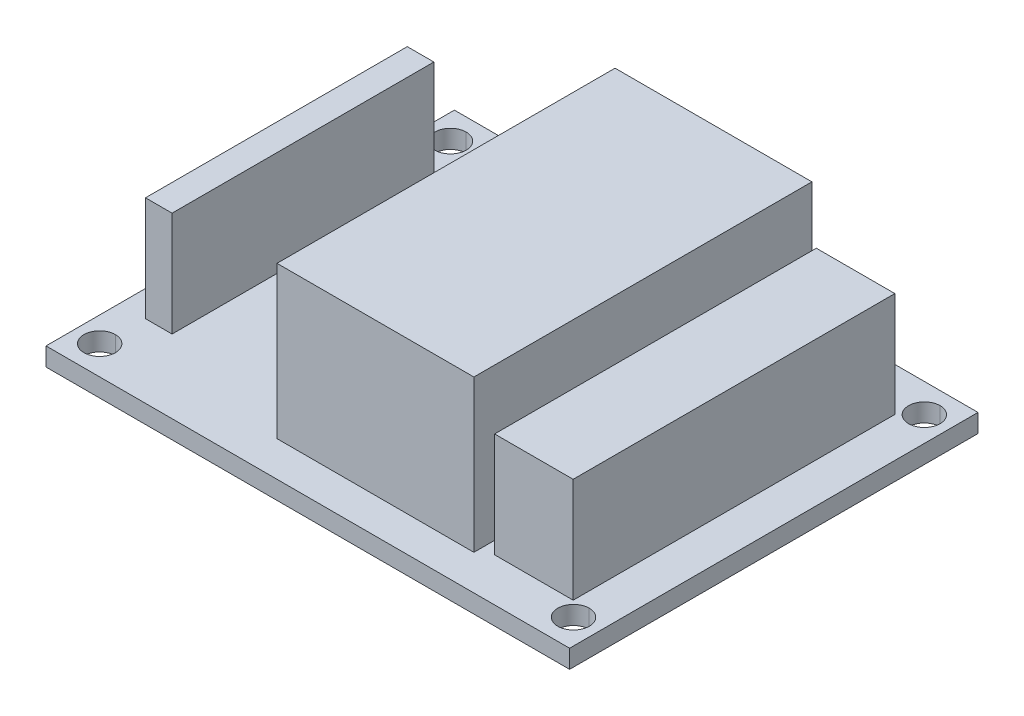
ISO-10303-21;
HEADER;
FILE_DESCRIPTION(('STEP AP214'),'2;1');
FILE_NAME('part.step','',(''),(''),'','','');
FILE_SCHEMA(('AUTOMOTIVE_DESIGN { 1 0 10303 214 1 1 1 1 }'));
ENDSEC;
DATA;
#1=APPLICATION_CONTEXT('core data for automotive mechanical design processes');
#2=APPLICATION_PROTOCOL_DEFINITION('international standard','automotive_design',2000,#1);
#3=PRODUCT_CONTEXT('',#1,'mechanical');
#4=PRODUCT('Part','Part','',(#3));
#5=PRODUCT_RELATED_PRODUCT_CATEGORY('part','',(#4));
#6=PRODUCT_DEFINITION_FORMATION('','',#4);
#7=PRODUCT_DEFINITION_CONTEXT('part definition',#1,'design');
#8=PRODUCT_DEFINITION('design','',#6,#7);
#9=PRODUCT_DEFINITION_SHAPE('','',#8);
#10=(LENGTH_UNIT() NAMED_UNIT(*) SI_UNIT(.MILLI.,.METRE.));
#11=(NAMED_UNIT(*) PLANE_ANGLE_UNIT() SI_UNIT($,.RADIAN.));
#12=(NAMED_UNIT(*) SI_UNIT($,.STERADIAN.) SOLID_ANGLE_UNIT());
#13=UNCERTAINTY_MEASURE_WITH_UNIT(LENGTH_MEASURE(1.E-05),#10,'distance_accuracy_value','');
#14=(GEOMETRIC_REPRESENTATION_CONTEXT(3) GLOBAL_UNCERTAINTY_ASSIGNED_CONTEXT((#13)) GLOBAL_UNIT_ASSIGNED_CONTEXT((#10,
#11,#12)) REPRESENTATION_CONTEXT('',''));
#15=CARTESIAN_POINT('',(0.,0.,0.));
#16=DIRECTION('',(0.,0.,1.));
#17=DIRECTION('',(1.,0.,0.));
#18=AXIS2_PLACEMENT_3D('',#15,#16,#17);
#19=CARTESIAN_POINT('',(0.,11.75,0.));
#20=DIRECTION('',(0.,1.,0.));
#21=DIRECTION('',(1.,0.,0.));
#22=AXIS2_PLACEMENT_3D('',#19,#20,#21);
#23=PLANE('',#22);
#24=DIRECTION('',(0.,0.,-1.));
#25=VECTOR('',#24,1.);
#26=CARTESIAN_POINT('',(-19.96,11.75,-12.5));
#27=LINE('',#26,#25);
#28=CARTESIAN_POINT('',(-19.96,11.75,12.5));
#29=VERTEX_POINT('',#28);
#30=CARTESIAN_POINT('',(-19.96,11.75,-12.5));
#31=VERTEX_POINT('',#30);
#32=EDGE_CURVE('E324',#29,#31,#27,.T.);
#33=ORIENTED_EDGE('',*,*,#32,.T.);
#34=DIRECTION('',(-1.,0.,0.));
#35=VECTOR('',#34,1.);
#36=CARTESIAN_POINT('',(-22.5,11.75,-12.5));
#37=LINE('',#36,#35);
#38=CARTESIAN_POINT('',(-22.5,11.75,-12.5));
#39=VERTEX_POINT('',#38);
#40=EDGE_CURVE('E403',#31,#39,#37,.T.);
#41=ORIENTED_EDGE('',*,*,#40,.T.);
#42=DIRECTION('',(0.,0.,1.));
#43=VECTOR('',#42,1.);
#44=CARTESIAN_POINT('',(-22.5,11.75,-12.5));
#45=LINE('',#44,#43);
#46=CARTESIAN_POINT('',(-22.5,11.75,12.5));
#47=VERTEX_POINT('',#46);
#48=EDGE_CURVE('E25',#39,#47,#45,.T.);
#49=ORIENTED_EDGE('',*,*,#48,.T.);
#50=DIRECTION('',(1.,0.,0.));
#51=VECTOR('',#50,1.);
#52=CARTESIAN_POINT('',(-22.5,11.75,12.5));
#53=LINE('',#52,#51);
#54=EDGE_CURVE('E10',#47,#29,#53,.T.);
#55=ORIENTED_EDGE('',*,*,#54,.T.);
#56=EDGE_LOOP('',(#33,#41,#49,#55));
#57=FACE_BOUND('',#56,.T.);
#58=ADVANCED_FACE('F15',(#57),#23,.T.);
#59=CARTESIAN_POINT('',(-22.5,11.75,12.5));
#60=DIRECTION('',(0.,0.,-1.));
#61=DIRECTION('',(0.,-1.,0.));
#62=AXIS2_PLACEMENT_3D('',#59,#60,#61);
#63=PLANE('',#62);
#64=DIRECTION('',(1.,0.,0.));
#65=VECTOR('',#64,1.);
#66=CARTESIAN_POINT('',(-22.5,1.75,12.5));
#67=LINE('',#66,#65);
#68=CARTESIAN_POINT('',(-22.5,1.75,12.5));
#69=VERTEX_POINT('',#68);
#70=CARTESIAN_POINT('',(-19.96,1.75,12.5));
#71=VERTEX_POINT('',#70);
#72=EDGE_CURVE('E428',#69,#71,#67,.T.);
#73=ORIENTED_EDGE('',*,*,#72,.T.);
#74=DIRECTION('',(0.,-1.,0.));
#75=VECTOR('',#74,1.);
#76=CARTESIAN_POINT('',(-19.96,11.75,12.5));
#77=LINE('',#76,#75);
#78=EDGE_CURVE('E395',#29,#71,#77,.T.);
#79=ORIENTED_EDGE('',*,*,#78,.F.);
#80=ORIENTED_EDGE('',*,*,#54,.F.);
#81=DIRECTION('',(0.,-1.,0.));
#82=VECTOR('',#81,1.);
#83=CARTESIAN_POINT('',(-22.5,11.75,12.5));
#84=LINE('',#83,#82);
#85=EDGE_CURVE('E439',#47,#69,#84,.T.);
#86=ORIENTED_EDGE('',*,*,#85,.T.);
#87=EDGE_LOOP('',(#73,#79,#80,#86));
#88=FACE_BOUND('',#87,.T.);
#89=ADVANCED_FACE('F722',(#88),#63,.F.);
#90=CARTESIAN_POINT('',(-22.5,11.75,-12.5));
#91=DIRECTION('',(1.,0.,0.));
#92=DIRECTION('',(0.,0.,-1.));
#93=AXIS2_PLACEMENT_3D('',#90,#91,#92);
#94=PLANE('',#93);
#95=DIRECTION('',(0.,0.,1.));
#96=VECTOR('',#95,1.);
#97=CARTESIAN_POINT('',(-22.5,1.75,-12.5));
#98=LINE('',#97,#96);
#99=CARTESIAN_POINT('',(-22.5,1.75,-12.5));
#100=VERTEX_POINT('',#99);
#101=EDGE_CURVE('E419',#100,#69,#98,.T.);
#102=ORIENTED_EDGE('',*,*,#101,.T.);
#103=ORIENTED_EDGE('',*,*,#85,.F.);
#104=ORIENTED_EDGE('',*,*,#48,.F.);
#105=DIRECTION('',(0.,-1.,0.));
#106=VECTOR('',#105,1.);
#107=CARTESIAN_POINT('',(-22.5,11.75,-12.5));
#108=LINE('',#107,#106);
#109=EDGE_CURVE('E400',#39,#100,#108,.T.);
#110=ORIENTED_EDGE('',*,*,#109,.T.);
#111=EDGE_LOOP('',(#102,#103,#104,#110));
#112=FACE_BOUND('',#111,.T.);
#113=ADVANCED_FACE('F718',(#112),#94,.F.);
#114=CARTESIAN_POINT('',(-22.5,11.75,-12.5));
#115=DIRECTION('',(0.,0.,1.));
#116=DIRECTION('',(1.,0.,0.));
#117=AXIS2_PLACEMENT_3D('',#114,#115,#116);
#118=PLANE('',#117);
#119=DIRECTION('',(-1.,0.,0.));
#120=VECTOR('',#119,1.);
#121=CARTESIAN_POINT('',(-22.5,1.75,-12.5));
#122=LINE('',#121,#120);
#123=CARTESIAN_POINT('',(-19.96,1.75,-12.5));
#124=VERTEX_POINT('',#123);
#125=EDGE_CURVE('E452',#124,#100,#122,.T.);
#126=ORIENTED_EDGE('',*,*,#125,.T.);
#127=ORIENTED_EDGE('',*,*,#109,.F.);
#128=ORIENTED_EDGE('',*,*,#40,.F.);
#129=DIRECTION('',(0.,-1.,0.));
#130=VECTOR('',#129,1.);
#131=CARTESIAN_POINT('',(-19.96,11.75,-12.5));
#132=LINE('',#131,#130);
#133=EDGE_CURVE('E321',#31,#124,#132,.T.);
#134=ORIENTED_EDGE('',*,*,#133,.T.);
#135=EDGE_LOOP('',(#126,#127,#128,#134));
#136=FACE_BOUND('',#135,.T.);
#137=ADVANCED_FACE('F527',(#136),#118,.F.);
#138=CARTESIAN_POINT('',(-19.96,11.75,-12.5));
#139=DIRECTION('',(-1.,0.,0.));
#140=DIRECTION('',(0.,0.,1.));
#141=AXIS2_PLACEMENT_3D('',#138,#139,#140);
#142=PLANE('',#141);
#143=DIRECTION('',(0.,0.,-1.));
#144=VECTOR('',#143,1.);
#145=CARTESIAN_POINT('',(-19.96,1.75,-12.5));
#146=LINE('',#145,#144);
#147=EDGE_CURVE('E364',#71,#124,#146,.T.);
#148=ORIENTED_EDGE('',*,*,#147,.T.);
#149=ORIENTED_EDGE('',*,*,#133,.F.);
#150=ORIENTED_EDGE('',*,*,#32,.F.);
#151=ORIENTED_EDGE('',*,*,#78,.T.);
#152=EDGE_LOOP('',(#148,#149,#150,#151));
#153=FACE_BOUND('',#152,.T.);
#154=ADVANCED_FACE('F517',(#153),#142,.F.);
#155=CARTESIAN_POINT('',(0.,11.75,0.));
#156=DIRECTION('',(0.,1.,0.));
#157=DIRECTION('',(1.,0.,0.));
#158=AXIS2_PLACEMENT_3D('',#155,#156,#157);
#159=PLANE('',#158);
#160=DIRECTION('',(0.,0.,-1.));
#161=VECTOR('',#160,1.);
#162=CARTESIAN_POINT('',(21.2,11.75,-15.36));
#163=LINE('',#162,#161);
#164=CARTESIAN_POINT('',(21.2,11.75,15.36));
#165=VERTEX_POINT('',#164);
#166=CARTESIAN_POINT('',(21.2,11.75,-15.36));
#167=VERTEX_POINT('',#166);
#168=EDGE_CURVE('E348',#165,#167,#163,.T.);
#169=ORIENTED_EDGE('',*,*,#168,.T.);
#170=DIRECTION('',(-1.,0.,0.));
#171=VECTOR('',#170,1.);
#172=CARTESIAN_POINT('',(13.7,11.75,-15.36));
#173=LINE('',#172,#171);
#174=CARTESIAN_POINT('',(13.7,11.75,-15.36));
#175=VERTEX_POINT('',#174);
#176=EDGE_CURVE('E311',#167,#175,#173,.T.);
#177=ORIENTED_EDGE('',*,*,#176,.T.);
#178=DIRECTION('',(0.,0.,1.));
#179=VECTOR('',#178,1.);
#180=CARTESIAN_POINT('',(13.7,11.75,-15.36));
#181=LINE('',#180,#179);
#182=CARTESIAN_POINT('',(13.7,11.75,15.36));
#183=VERTEX_POINT('',#182);
#184=EDGE_CURVE('E356',#175,#183,#181,.T.);
#185=ORIENTED_EDGE('',*,*,#184,.T.);
#186=DIRECTION('',(1.,0.,0.));
#187=VECTOR('',#186,1.);
#188=CARTESIAN_POINT('',(13.7,11.75,15.36));
#189=LINE('',#188,#187);
#190=EDGE_CURVE('E325',#183,#165,#189,.T.);
#191=ORIENTED_EDGE('',*,*,#190,.T.);
#192=EDGE_LOOP('',(#169,#177,#185,#191));
#193=FACE_BOUND('',#192,.T.);
#194=ADVANCED_FACE('F695',(#193),#159,.T.);
#195=CARTESIAN_POINT('',(13.7,11.75,15.36));
#196=DIRECTION('',(0.,0.,-1.));
#197=DIRECTION('',(0.,-1.,0.));
#198=AXIS2_PLACEMENT_3D('',#195,#196,#197);
#199=PLANE('',#198);
#200=DIRECTION('',(1.,0.,0.));
#201=VECTOR('',#200,1.);
#202=CARTESIAN_POINT('',(13.7,1.75,15.36));
#203=LINE('',#202,#201);
#204=CARTESIAN_POINT('',(13.7,1.75,15.36));
#205=VERTEX_POINT('',#204);
#206=CARTESIAN_POINT('',(21.2,1.75,15.36));
#207=VERTEX_POINT('',#206);
#208=EDGE_CURVE('E279',#205,#207,#203,.T.);
#209=ORIENTED_EDGE('',*,*,#208,.T.);
#210=DIRECTION('',(0.,-1.,0.));
#211=VECTOR('',#210,1.);
#212=CARTESIAN_POINT('',(21.2,11.75,15.36));
#213=LINE('',#212,#211);
#214=EDGE_CURVE('E352',#165,#207,#213,.T.);
#215=ORIENTED_EDGE('',*,*,#214,.F.);
#216=ORIENTED_EDGE('',*,*,#190,.F.);
#217=DIRECTION('',(0.,-1.,0.));
#218=VECTOR('',#217,1.);
#219=CARTESIAN_POINT('',(13.7,11.75,15.36));
#220=LINE('',#219,#218);
#221=EDGE_CURVE('E315',#183,#205,#220,.T.);
#222=ORIENTED_EDGE('',*,*,#221,.T.);
#223=EDGE_LOOP('',(#209,#215,#216,#222));
#224=FACE_BOUND('',#223,.T.);
#225=ADVANCED_FACE('F691',(#224),#199,.F.);
#226=CARTESIAN_POINT('',(13.7,11.75,-15.36));
#227=DIRECTION('',(1.,0.,0.));
#228=DIRECTION('',(0.,0.,-1.));
#229=AXIS2_PLACEMENT_3D('',#226,#227,#228);
#230=PLANE('',#229);
#231=DIRECTION('',(0.,0.,1.));
#232=VECTOR('',#231,1.);
#233=CARTESIAN_POINT('',(13.7,1.75,-15.36));
#234=LINE('',#233,#232);
#235=CARTESIAN_POINT('',(13.7,1.75,-15.36));
#236=VERTEX_POINT('',#235);
#237=EDGE_CURVE('E478',#236,#205,#234,.T.);
#238=ORIENTED_EDGE('',*,*,#237,.T.);
#239=ORIENTED_EDGE('',*,*,#221,.F.);
#240=ORIENTED_EDGE('',*,*,#184,.F.);
#241=DIRECTION('',(0.,-1.,0.));
#242=VECTOR('',#241,1.);
#243=CARTESIAN_POINT('',(13.7,11.75,-15.36));
#244=LINE('',#243,#242);
#245=EDGE_CURVE('E316',#175,#236,#244,.T.);
#246=ORIENTED_EDGE('',*,*,#245,.T.);
#247=EDGE_LOOP('',(#238,#239,#240,#246));
#248=FACE_BOUND('',#247,.T.);
#249=ADVANCED_FACE('F624',(#248),#230,.F.);
#250=CARTESIAN_POINT('',(13.7,11.75,-15.36));
#251=DIRECTION('',(0.,0.,1.));
#252=DIRECTION('',(1.,0.,0.));
#253=AXIS2_PLACEMENT_3D('',#250,#251,#252);
#254=PLANE('',#253);
#255=DIRECTION('',(-1.,0.,0.));
#256=VECTOR('',#255,1.);
#257=CARTESIAN_POINT('',(13.7,1.75,-15.36));
#258=LINE('',#257,#256);
#259=CARTESIAN_POINT('',(21.2,1.75,-15.36));
#260=VERTEX_POINT('',#259);
#261=EDGE_CURVE('E484',#260,#236,#258,.T.);
#262=ORIENTED_EDGE('',*,*,#261,.T.);
#263=ORIENTED_EDGE('',*,*,#245,.F.);
#264=ORIENTED_EDGE('',*,*,#176,.F.);
#265=DIRECTION('',(0.,-1.,0.));
#266=VECTOR('',#265,1.);
#267=CARTESIAN_POINT('',(21.2,11.75,-15.36));
#268=LINE('',#267,#266);
#269=EDGE_CURVE('E309',#167,#260,#268,.T.);
#270=ORIENTED_EDGE('',*,*,#269,.T.);
#271=EDGE_LOOP('',(#262,#263,#264,#270));
#272=FACE_BOUND('',#271,.T.);
#273=ADVANCED_FACE('F607',(#272),#254,.F.);
#274=CARTESIAN_POINT('',(21.2,11.75,-15.36));
#275=DIRECTION('',(-1.,0.,0.));
#276=DIRECTION('',(0.,1.,0.));
#277=AXIS2_PLACEMENT_3D('',#274,#275,#276);
#278=PLANE('',#277);
#279=DIRECTION('',(0.,0.,-1.));
#280=VECTOR('',#279,1.);
#281=CARTESIAN_POINT('',(21.2,1.75,-15.36));
#282=LINE('',#281,#280);
#283=EDGE_CURVE('E264',#207,#260,#282,.T.);
#284=ORIENTED_EDGE('',*,*,#283,.T.);
#285=ORIENTED_EDGE('',*,*,#269,.F.);
#286=ORIENTED_EDGE('',*,*,#168,.F.);
#287=ORIENTED_EDGE('',*,*,#214,.T.);
#288=EDGE_LOOP('',(#284,#285,#286,#287));
#289=FACE_BOUND('',#288,.T.);
#290=ADVANCED_FACE('F599',(#289),#278,.F.);
#291=CARTESIAN_POINT('',(0.,16.25,0.));
#292=DIRECTION('',(0.,-1.,0.));
#293=DIRECTION('',(0.,0.,-1.));
#294=AXIS2_PLACEMENT_3D('',#291,#292,#293);
#295=PLANE('',#294);
#296=DIRECTION('',(0.,0.,1.));
#297=VECTOR('',#296,1.);
#298=CARTESIAN_POINT('',(-6.3,16.25,-16.14));
#299=LINE('',#298,#297);
#300=CARTESIAN_POINT('',(-6.3,16.25,-16.14));
#301=VERTEX_POINT('',#300);
#302=CARTESIAN_POINT('',(-6.3,16.25,16.14));
#303=VERTEX_POINT('',#302);
#304=EDGE_CURVE('E328',#301,#303,#299,.T.);
#305=ORIENTED_EDGE('',*,*,#304,.T.);
#306=DIRECTION('',(1.,0.,0.));
#307=VECTOR('',#306,1.);
#308=CARTESIAN_POINT('',(12.5,16.25,16.14));
#309=LINE('',#308,#307);
#310=CARTESIAN_POINT('',(12.5,16.25,16.14));
#311=VERTEX_POINT('',#310);
#312=EDGE_CURVE('E294',#303,#311,#309,.T.);
#313=ORIENTED_EDGE('',*,*,#312,.T.);
#314=DIRECTION('',(0.,0.,-1.));
#315=VECTOR('',#314,1.);
#316=CARTESIAN_POINT('',(12.5,16.25,-16.14));
#317=LINE('',#316,#315);
#318=CARTESIAN_POINT('',(12.5,16.25,-16.14));
#319=VERTEX_POINT('',#318);
#320=EDGE_CURVE('E310',#311,#319,#317,.T.);
#321=ORIENTED_EDGE('',*,*,#320,.T.);
#322=DIRECTION('',(-1.,0.,0.));
#323=VECTOR('',#322,1.);
#324=CARTESIAN_POINT('',(12.5,16.25,-16.14));
#325=LINE('',#324,#323);
#326=EDGE_CURVE('E306',#319,#301,#325,.T.);
#327=ORIENTED_EDGE('',*,*,#326,.T.);
#328=EDGE_LOOP('',(#305,#313,#321,#327));
#329=FACE_BOUND('',#328,.T.);
#330=ADVANCED_FACE('F17',(#329),#295,.F.);
#331=CARTESIAN_POINT('',(12.5,16.25,-16.14));
#332=DIRECTION('',(0.,0.,1.));
#333=DIRECTION('',(1.,0.,0.));
#334=AXIS2_PLACEMENT_3D('',#331,#332,#333);
#335=PLANE('',#334);
#336=DIRECTION('',(-1.,0.,0.));
#337=VECTOR('',#336,1.);
#338=CARTESIAN_POINT('',(12.5,1.75,-16.14));
#339=LINE('',#338,#337);
#340=CARTESIAN_POINT('',(12.5,1.75,-16.14));
#341=VERTEX_POINT('',#340);
#342=CARTESIAN_POINT('',(-6.3,1.75,-16.14));
#343=VERTEX_POINT('',#342);
#344=EDGE_CURVE('E337',#341,#343,#339,.T.);
#345=ORIENTED_EDGE('',*,*,#344,.T.);
#346=DIRECTION('',(0.,-1.,0.));
#347=VECTOR('',#346,1.);
#348=CARTESIAN_POINT('',(-6.3,16.25,-16.14));
#349=LINE('',#348,#347);
#350=EDGE_CURVE('E295',#301,#343,#349,.T.);
#351=ORIENTED_EDGE('',*,*,#350,.F.);
#352=ORIENTED_EDGE('',*,*,#326,.F.);
#353=DIRECTION('',(0.,-1.,0.));
#354=VECTOR('',#353,1.);
#355=CARTESIAN_POINT('',(12.5,16.25,-16.14));
#356=LINE('',#355,#354);
#357=EDGE_CURVE('E304',#319,#341,#356,.T.);
#358=ORIENTED_EDGE('',*,*,#357,.T.);
#359=EDGE_LOOP('',(#345,#351,#352,#358));
#360=FACE_BOUND('',#359,.T.);
#361=ADVANCED_FACE('F598',(#360),#335,.F.);
#362=CARTESIAN_POINT('',(12.5,16.25,-16.14));
#363=DIRECTION('',(-1.,0.,0.));
#364=DIRECTION('',(0.,1.,0.));
#365=AXIS2_PLACEMENT_3D('',#362,#363,#364);
#366=PLANE('',#365);
#367=DIRECTION('',(0.,0.,-1.));
#368=VECTOR('',#367,1.);
#369=CARTESIAN_POINT('',(12.5,1.75,-16.14));
#370=LINE('',#369,#368);
#371=CARTESIAN_POINT('',(12.5,1.75,16.14));
#372=VERTEX_POINT('',#371);
#373=EDGE_CURVE('E365',#372,#341,#370,.T.);
#374=ORIENTED_EDGE('',*,*,#373,.T.);
#375=ORIENTED_EDGE('',*,*,#357,.F.);
#376=ORIENTED_EDGE('',*,*,#320,.F.);
#377=DIRECTION('',(0.,-1.,0.));
#378=VECTOR('',#377,1.);
#379=CARTESIAN_POINT('',(12.5,16.25,16.14));
#380=LINE('',#379,#378);
#381=EDGE_CURVE('E291',#311,#372,#380,.T.);
#382=ORIENTED_EDGE('',*,*,#381,.T.);
#383=EDGE_LOOP('',(#374,#375,#376,#382));
#384=FACE_BOUND('',#383,.T.);
#385=ADVANCED_FACE('F633',(#384),#366,.F.);
#386=CARTESIAN_POINT('',(12.5,16.25,16.14));
#387=DIRECTION('',(0.,0.,-1.));
#388=DIRECTION('',(-1.,0.,0.));
#389=AXIS2_PLACEMENT_3D('',#386,#387,#388);
#390=PLANE('',#389);
#391=DIRECTION('',(1.,0.,0.));
#392=VECTOR('',#391,1.);
#393=CARTESIAN_POINT('',(12.5,1.75,16.14));
#394=LINE('',#393,#392);
#395=CARTESIAN_POINT('',(-6.3,1.75,16.14));
#396=VERTEX_POINT('',#395);
#397=EDGE_CURVE('E360',#396,#372,#394,.T.);
#398=ORIENTED_EDGE('',*,*,#397,.T.);
#399=ORIENTED_EDGE('',*,*,#381,.F.);
#400=ORIENTED_EDGE('',*,*,#312,.F.);
#401=DIRECTION('',(0.,-1.,0.));
#402=VECTOR('',#401,1.);
#403=CARTESIAN_POINT('',(-6.3,16.25,16.14));
#404=LINE('',#403,#402);
#405=EDGE_CURVE('E256',#303,#396,#404,.T.);
#406=ORIENTED_EDGE('',*,*,#405,.T.);
#407=EDGE_LOOP('',(#398,#399,#400,#406));
#408=FACE_BOUND('',#407,.T.);
#409=ADVANCED_FACE('F704',(#408),#390,.F.);
#410=CARTESIAN_POINT('',(-6.3,16.25,-16.14));
#411=DIRECTION('',(1.,0.,0.));
#412=DIRECTION('',(0.,0.,-1.));
#413=AXIS2_PLACEMENT_3D('',#410,#411,#412);
#414=PLANE('',#413);
#415=DIRECTION('',(0.,0.,1.));
#416=VECTOR('',#415,1.);
#417=CARTESIAN_POINT('',(-6.3,1.75,-16.14));
#418=LINE('',#417,#416);
#419=EDGE_CURVE('E333',#343,#396,#418,.T.);
#420=ORIENTED_EDGE('',*,*,#419,.T.);
#421=ORIENTED_EDGE('',*,*,#405,.F.);
#422=ORIENTED_EDGE('',*,*,#304,.F.);
#423=ORIENTED_EDGE('',*,*,#350,.T.);
#424=EDGE_LOOP('',(#420,#421,#422,#423));
#425=FACE_BOUND('',#424,.T.);
#426=ADVANCED_FACE('F644',(#425),#414,.F.);
#427=CARTESIAN_POINT('',(22.625,1.75,-16.75));
#428=DIRECTION('',(0.,-1.,0.));
#429=DIRECTION('',(0.,0.,-1.));
#430=AXIS2_PLACEMENT_3D('',#427,#428,#429);
#431=CYLINDRICAL_SURFACE('',#430,1.5);
#432=DIRECTION('',(0.,-1.,0.));
#433=VECTOR('',#432,1.);
#434=CARTESIAN_POINT('',(22.625,1.75,-15.25));
#435=LINE('',#434,#433);
#436=CARTESIAN_POINT('',(22.625,1.75,-15.25));
#437=VERTEX_POINT('',#436);
#438=CARTESIAN_POINT('',(22.625,0.,-15.25));
#439=VERTEX_POINT('',#438);
#440=EDGE_CURVE('E373',#437,#439,#435,.T.);
#441=ORIENTED_EDGE('',*,*,#440,.F.);
#442=CARTESIAN_POINT('',(22.625,1.75,-16.75));
#443=DIRECTION('',(0.,1.,0.));
#444=DIRECTION('',(0.,0.,1.));
#445=AXIS2_PLACEMENT_3D('',#442,#443,#444);
#446=CIRCLE('',#445,1.5);
#447=CARTESIAN_POINT('',(22.625,1.75,-18.25));
#448=VERTEX_POINT('',#447);
#449=EDGE_CURVE('E284',#437,#448,#446,.T.);
#450=ORIENTED_EDGE('',*,*,#449,.T.);
#451=DIRECTION('',(0.,-1.,0.));
#452=VECTOR('',#451,1.);
#453=CARTESIAN_POINT('',(22.625,1.75,-18.25));
#454=LINE('',#453,#452);
#455=CARTESIAN_POINT('',(22.625,0.,-18.25));
#456=VERTEX_POINT('',#455);
#457=EDGE_CURVE('E341',#448,#456,#454,.T.);
#458=ORIENTED_EDGE('',*,*,#457,.T.);
#459=CARTESIAN_POINT('',(22.625,0.,-16.75));
#460=DIRECTION('',(0.,1.,0.));
#461=DIRECTION('',(0.,0.,1.));
#462=AXIS2_PLACEMENT_3D('',#459,#460,#461);
#463=CIRCLE('',#462,1.5);
#464=EDGE_CURVE('E379',#439,#456,#463,.T.);
#465=ORIENTED_EDGE('',*,*,#464,.F.);
#466=EDGE_LOOP('',(#441,#450,#458,#465));
#467=FACE_BOUND('',#466,.T.);
#468=ADVANCED_FACE('F639',(#467),#431,.F.);
#469=CARTESIAN_POINT('',(22.625,1.75,16.75));
#470=DIRECTION('',(0.,-1.,0.));
#471=DIRECTION('',(0.,0.,-1.));
#472=AXIS2_PLACEMENT_3D('',#469,#470,#471);
#473=CYLINDRICAL_SURFACE('',#472,1.5);
#474=DIRECTION('',(0.,-1.,0.));
#475=VECTOR('',#474,1.);
#476=CARTESIAN_POINT('',(22.625,1.75,18.25));
#477=LINE('',#476,#475);
#478=CARTESIAN_POINT('',(22.625,1.75,18.25));
#479=VERTEX_POINT('',#478);
#480=CARTESIAN_POINT('',(22.625,0.,18.25));
#481=VERTEX_POINT('',#480);
#482=EDGE_CURVE('E290',#479,#481,#477,.T.);
#483=ORIENTED_EDGE('',*,*,#482,.F.);
#484=CARTESIAN_POINT('',(22.625,1.75,16.75));
#485=DIRECTION('',(0.,1.,0.));
#486=DIRECTION('',(0.,0.,1.));
#487=AXIS2_PLACEMENT_3D('',#484,#485,#486);
#488=CIRCLE('',#487,1.5);
#489=CARTESIAN_POINT('',(22.625,1.75,15.25));
#490=VERTEX_POINT('',#489);
#491=EDGE_CURVE('E281',#479,#490,#488,.T.);
#492=ORIENTED_EDGE('',*,*,#491,.T.);
#493=DIRECTION('',(0.,-1.,0.));
#494=VECTOR('',#493,1.);
#495=CARTESIAN_POINT('',(22.625,1.75,15.25));
#496=LINE('',#495,#494);
#497=CARTESIAN_POINT('',(22.625,0.,15.25));
#498=VERTEX_POINT('',#497);
#499=EDGE_CURVE('E289',#490,#498,#496,.T.);
#500=ORIENTED_EDGE('',*,*,#499,.T.);
#501=CARTESIAN_POINT('',(22.625,0.,16.75));
#502=DIRECTION('',(0.,1.,0.));
#503=DIRECTION('',(0.,0.,1.));
#504=AXIS2_PLACEMENT_3D('',#501,#502,#503);
#505=CIRCLE('',#504,1.5);
#506=EDGE_CURVE('E372',#481,#498,#505,.T.);
#507=ORIENTED_EDGE('',*,*,#506,.F.);
#508=EDGE_LOOP('',(#483,#492,#500,#507));
#509=FACE_BOUND('',#508,.T.);
#510=ADVANCED_FACE('F643',(#509),#473,.F.);
#511=CARTESIAN_POINT('',(-22.625,1.75,16.75));
#512=DIRECTION('',(0.,-1.,0.));
#513=DIRECTION('',(0.,0.,-1.));
#514=AXIS2_PLACEMENT_3D('',#511,#512,#513);
#515=CYLINDRICAL_SURFACE('',#514,1.5);
#516=DIRECTION('',(0.,-1.,0.));
#517=VECTOR('',#516,1.);
#518=CARTESIAN_POINT('',(-22.625,1.75,18.25));
#519=LINE('',#518,#517);
#520=CARTESIAN_POINT('',(-22.625,1.75,18.25));
#521=VERTEX_POINT('',#520);
#522=CARTESIAN_POINT('',(-22.625,0.,18.25));
#523=VERTEX_POINT('',#522);
#524=EDGE_CURVE('E399',#521,#523,#519,.T.);
#525=ORIENTED_EDGE('',*,*,#524,.F.);
#526=CARTESIAN_POINT('',(-22.625,1.75,16.75));
#527=DIRECTION('',(0.,1.,0.));
#528=DIRECTION('',(0.,0.,1.));
#529=AXIS2_PLACEMENT_3D('',#526,#527,#528);
#530=CIRCLE('',#529,1.5);
#531=CARTESIAN_POINT('',(-22.625,1.75,15.25));
#532=VERTEX_POINT('',#531);
#533=EDGE_CURVE('E283',#521,#532,#530,.T.);
#534=ORIENTED_EDGE('',*,*,#533,.T.);
#535=DIRECTION('',(0.,-1.,0.));
#536=VECTOR('',#535,1.);
#537=CARTESIAN_POINT('',(-22.625,1.75,15.25));
#538=LINE('',#537,#536);
#539=CARTESIAN_POINT('',(-22.625,0.,15.25));
#540=VERTEX_POINT('',#539);
#541=EDGE_CURVE('E296',#532,#540,#538,.T.);
#542=ORIENTED_EDGE('',*,*,#541,.T.);
#543=CARTESIAN_POINT('',(-22.625,0.,16.75));
#544=DIRECTION('',(0.,1.,0.));
#545=DIRECTION('',(0.,0.,1.));
#546=AXIS2_PLACEMENT_3D('',#543,#544,#545);
#547=CIRCLE('',#546,1.5);
#548=EDGE_CURVE('E382',#523,#540,#547,.T.);
#549=ORIENTED_EDGE('',*,*,#548,.F.);
#550=EDGE_LOOP('',(#525,#534,#542,#549));
#551=FACE_BOUND('',#550,.T.);
#552=ADVANCED_FACE('F616',(#551),#515,.F.);
#553=CARTESIAN_POINT('',(-22.625,1.75,-16.75));
#554=DIRECTION('',(0.,-1.,0.));
#555=DIRECTION('',(0.,0.,-1.));
#556=AXIS2_PLACEMENT_3D('',#553,#554,#555);
#557=CYLINDRICAL_SURFACE('',#556,1.5);
#558=DIRECTION('',(0.,-1.,0.));
#559=VECTOR('',#558,1.);
#560=CARTESIAN_POINT('',(-22.625,1.75,-15.25));
#561=LINE('',#560,#559);
#562=CARTESIAN_POINT('',(-22.625,1.75,-15.25));
#563=VERTEX_POINT('',#562);
#564=CARTESIAN_POINT('',(-22.625,0.,-15.25));
#565=VERTEX_POINT('',#564);
#566=EDGE_CURVE('E359',#563,#565,#561,.T.);
#567=ORIENTED_EDGE('',*,*,#566,.F.);
#568=CARTESIAN_POINT('',(-22.625,1.75,-16.75));
#569=DIRECTION('',(0.,1.,0.));
#570=DIRECTION('',(0.,0.,1.));
#571=AXIS2_PLACEMENT_3D('',#568,#569,#570);
#572=CIRCLE('',#571,1.5);
#573=CARTESIAN_POINT('',(-22.625,1.75,-18.25));
#574=VERTEX_POINT('',#573);
#575=EDGE_CURVE('E182',#563,#574,#572,.T.);
#576=ORIENTED_EDGE('',*,*,#575,.T.);
#577=DIRECTION('',(0.,-1.,0.));
#578=VECTOR('',#577,1.);
#579=CARTESIAN_POINT('',(-22.625,1.75,-18.25));
#580=LINE('',#579,#578);
#581=CARTESIAN_POINT('',(-22.625,0.,-18.25));
#582=VERTEX_POINT('',#581);
#583=EDGE_CURVE('E342',#574,#582,#580,.T.);
#584=ORIENTED_EDGE('',*,*,#583,.T.);
#585=CARTESIAN_POINT('',(-22.625,0.,-16.75));
#586=DIRECTION('',(0.,1.,0.));
#587=DIRECTION('',(0.,0.,1.));
#588=AXIS2_PLACEMENT_3D('',#585,#586,#587);
#589=CIRCLE('',#588,1.5);
#590=EDGE_CURVE('E193',#565,#582,#589,.T.);
#591=ORIENTED_EDGE('',*,*,#590,.F.);
#592=EDGE_LOOP('',(#567,#576,#584,#591));
#593=FACE_BOUND('',#592,.T.);
#594=ADVANCED_FACE('F612',(#593),#557,.F.);
#595=CARTESIAN_POINT('',(25.,1.75,-19.5));
#596=DIRECTION('',(0.,0.,1.));
#597=DIRECTION('',(1.,0.,0.));
#598=AXIS2_PLACEMENT_3D('',#595,#596,#597);
#599=PLANE('',#598);
#600=DIRECTION('',(-1.,0.,0.));
#601=VECTOR('',#600,1.);
#602=CARTESIAN_POINT('',(25.,0.,-19.5));
#603=LINE('',#602,#601);
#604=CARTESIAN_POINT('',(25.,0.,-19.5));
#605=VERTEX_POINT('',#604);
#606=CARTESIAN_POINT('',(-25.,0.,-19.5));
#607=VERTEX_POINT('',#606);
#608=EDGE_CURVE('E451',#605,#607,#603,.T.);
#609=ORIENTED_EDGE('',*,*,#608,.T.);
#610=DIRECTION('',(0.,-1.,0.));
#611=VECTOR('',#610,1.);
#612=CARTESIAN_POINT('',(-25.,1.75,-19.5));
#613=LINE('',#612,#611);
#614=CARTESIAN_POINT('',(-25.,1.75,-19.5));
#615=VERTEX_POINT('',#614);
#616=EDGE_CURVE('E99',#615,#607,#613,.T.);
#617=ORIENTED_EDGE('',*,*,#616,.F.);
#618=DIRECTION('',(-1.,0.,0.));
#619=VECTOR('',#618,1.);
#620=CARTESIAN_POINT('',(25.,1.75,-19.5));
#621=LINE('',#620,#619);
#622=CARTESIAN_POINT('',(25.,1.75,-19.5));
#623=VERTEX_POINT('',#622);
#624=EDGE_CURVE('E259',#623,#615,#621,.T.);
#625=ORIENTED_EDGE('',*,*,#624,.F.);
#626=DIRECTION('',(0.,-1.,0.));
#627=VECTOR('',#626,1.);
#628=CARTESIAN_POINT('',(25.,1.75,-19.5));
#629=LINE('',#628,#627);
#630=EDGE_CURVE('E247',#623,#605,#629,.T.);
#631=ORIENTED_EDGE('',*,*,#630,.T.);
#632=EDGE_LOOP('',(#609,#617,#625,#631));
#633=FACE_BOUND('',#632,.T.);
#634=ADVANCED_FACE('F260',(#633),#599,.F.);
#635=CARTESIAN_POINT('',(25.,1.75,-19.5));
#636=DIRECTION('',(-1.,0.,0.));
#637=DIRECTION('',(0.,1.,0.));
#638=AXIS2_PLACEMENT_3D('',#635,#636,#637);
#639=PLANE('',#638);
#640=DIRECTION('',(0.,0.,-1.));
#641=VECTOR('',#640,1.);
#642=CARTESIAN_POINT('',(25.,0.,-19.5));
#643=LINE('',#642,#641);
#644=CARTESIAN_POINT('',(25.,0.,19.5));
#645=VERTEX_POINT('',#644);
#646=EDGE_CURVE('E253',#645,#605,#643,.T.);
#647=ORIENTED_EDGE('',*,*,#646,.T.);
#648=ORIENTED_EDGE('',*,*,#630,.F.);
#649=DIRECTION('',(0.,0.,-1.));
#650=VECTOR('',#649,1.);
#651=CARTESIAN_POINT('',(25.,1.75,-19.5));
#652=LINE('',#651,#650);
#653=CARTESIAN_POINT('',(25.,1.75,19.5));
#654=VERTEX_POINT('',#653);
#655=EDGE_CURVE('E250',#654,#623,#652,.T.);
#656=ORIENTED_EDGE('',*,*,#655,.F.);
#657=DIRECTION('',(0.,-1.,0.));
#658=VECTOR('',#657,1.);
#659=CARTESIAN_POINT('',(25.,1.75,19.5));
#660=LINE('',#659,#658);
#661=EDGE_CURVE('E257',#654,#645,#660,.T.);
#662=ORIENTED_EDGE('',*,*,#661,.T.);
#663=EDGE_LOOP('',(#647,#648,#656,#662));
#664=FACE_BOUND('',#663,.T.);
#665=ADVANCED_FACE('F248',(#664),#639,.F.);
#666=CARTESIAN_POINT('',(25.,1.75,19.5));
#667=DIRECTION('',(0.,0.,-1.));
#668=DIRECTION('',(-1.,0.,0.));
#669=AXIS2_PLACEMENT_3D('',#666,#667,#668);
#670=PLANE('',#669);
#671=DIRECTION('',(1.,0.,0.));
#672=VECTOR('',#671,1.);
#673=CARTESIAN_POINT('',(25.,0.,19.5));
#674=LINE('',#673,#672);
#675=CARTESIAN_POINT('',(-25.,0.,19.5));
#676=VERTEX_POINT('',#675);
#677=EDGE_CURVE('E368',#676,#645,#674,.T.);
#678=ORIENTED_EDGE('',*,*,#677,.T.);
#679=ORIENTED_EDGE('',*,*,#661,.F.);
#680=DIRECTION('',(1.,0.,0.));
#681=VECTOR('',#680,1.);
#682=CARTESIAN_POINT('',(25.,1.75,19.5));
#683=LINE('',#682,#681);
#684=CARTESIAN_POINT('',(-25.,1.75,19.5));
#685=VERTEX_POINT('',#684);
#686=EDGE_CURVE('E267',#685,#654,#683,.T.);
#687=ORIENTED_EDGE('',*,*,#686,.F.);
#688=DIRECTION('',(0.,-1.,0.));
#689=VECTOR('',#688,1.);
#690=CARTESIAN_POINT('',(-25.,1.75,19.5));
#691=LINE('',#690,#689);
#692=EDGE_CURVE('E82',#685,#676,#691,.T.);
#693=ORIENTED_EDGE('',*,*,#692,.T.);
#694=EDGE_LOOP('',(#678,#679,#687,#693));
#695=FACE_BOUND('',#694,.T.);
#696=ADVANCED_FACE('F660',(#695),#670,.F.);
#697=CARTESIAN_POINT('',(-25.,1.75,-19.5));
#698=DIRECTION('',(1.,0.,0.));
#699=DIRECTION('',(0.,0.,-1.));
#700=AXIS2_PLACEMENT_3D('',#697,#698,#699);
#701=PLANE('',#700);
#702=DIRECTION('',(0.,0.,1.));
#703=VECTOR('',#702,1.);
#704=CARTESIAN_POINT('',(-25.,0.,-19.5));
#705=LINE('',#704,#703);
#706=EDGE_CURVE('E448',#607,#676,#705,.T.);
#707=ORIENTED_EDGE('',*,*,#706,.T.);
#708=ORIENTED_EDGE('',*,*,#692,.F.);
#709=DIRECTION('',(0.,0.,1.));
#710=VECTOR('',#709,1.);
#711=CARTESIAN_POINT('',(-25.,1.75,-19.5));
#712=LINE('',#711,#710);
#713=EDGE_CURVE('E275',#615,#685,#712,.T.);
#714=ORIENTED_EDGE('',*,*,#713,.F.);
#715=ORIENTED_EDGE('',*,*,#616,.T.);
#716=EDGE_LOOP('',(#707,#708,#714,#715));
#717=FACE_BOUND('',#716,.T.);
#718=ADVANCED_FACE('F678',(#717),#701,.F.);
#719=CARTESIAN_POINT('',(0.,0.,0.));
#720=DIRECTION('',(0.,-1.,0.));
#721=DIRECTION('',(0.,0.,-1.));
#722=AXIS2_PLACEMENT_3D('',#719,#720,#721);
#723=PLANE('',#722);
#724=CARTESIAN_POINT('',(22.625,0.,-16.75));
#725=DIRECTION('',(0.,1.,0.));
#726=DIRECTION('',(0.,0.,1.));
#727=AXIS2_PLACEMENT_3D('',#724,#725,#726);
#728=CIRCLE('',#727,1.5);
#729=EDGE_CURVE('E377',#456,#439,#728,.T.);
#730=ORIENTED_EDGE('',*,*,#729,.T.);
#731=ORIENTED_EDGE('',*,*,#464,.T.);
#732=EDGE_LOOP('',(#730,#731));
#733=FACE_BOUND('',#732,.T.);
#734=CARTESIAN_POINT('',(-22.625,0.,16.75));
#735=DIRECTION('',(0.,1.,0.));
#736=DIRECTION('',(0.,0.,1.));
#737=AXIS2_PLACEMENT_3D('',#734,#735,#736);
#738=CIRCLE('',#737,1.5);
#739=EDGE_CURVE('E301',#540,#523,#738,.T.);
#740=ORIENTED_EDGE('',*,*,#739,.T.);
#741=ORIENTED_EDGE('',*,*,#548,.T.);
#742=EDGE_LOOP('',(#740,#741));
#743=FACE_BOUND('',#742,.T.);
#744=CARTESIAN_POINT('',(-22.625,0.,-16.75));
#745=DIRECTION('',(0.,1.,0.));
#746=DIRECTION('',(0.,0.,1.));
#747=AXIS2_PLACEMENT_3D('',#744,#745,#746);
#748=CIRCLE('',#747,1.5);
#749=EDGE_CURVE('E345',#582,#565,#748,.T.);
#750=ORIENTED_EDGE('',*,*,#749,.T.);
#751=ORIENTED_EDGE('',*,*,#590,.T.);
#752=EDGE_LOOP('',(#750,#751));
#753=FACE_BOUND('',#752,.T.);
#754=CARTESIAN_POINT('',(22.625,0.,16.75));
#755=DIRECTION('',(0.,1.,0.));
#756=DIRECTION('',(0.,0.,1.));
#757=AXIS2_PLACEMENT_3D('',#754,#755,#756);
#758=CIRCLE('',#757,1.5);
#759=EDGE_CURVE('E285',#498,#481,#758,.T.);
#760=ORIENTED_EDGE('',*,*,#759,.T.);
#761=ORIENTED_EDGE('',*,*,#506,.T.);
#762=EDGE_LOOP('',(#760,#761));
#763=FACE_BOUND('',#762,.T.);
#764=ORIENTED_EDGE('',*,*,#706,.F.);
#765=ORIENTED_EDGE('',*,*,#608,.F.);
#766=ORIENTED_EDGE('',*,*,#646,.F.);
#767=ORIENTED_EDGE('',*,*,#677,.F.);
#768=EDGE_LOOP('',(#764,#765,#766,#767));
#769=FACE_BOUND('',#768,.T.);
#770=ADVANCED_FACE('F686',(#733,#743,#753,#763,#769),#723,.T.);
#771=CARTESIAN_POINT('',(0.,1.75,0.));
#772=DIRECTION('',(0.,-1.,0.));
#773=DIRECTION('',(0.,0.,-1.));
#774=AXIS2_PLACEMENT_3D('',#771,#772,#773);
#775=PLANE('',#774);
#776=ORIENTED_EDGE('',*,*,#147,.F.);
#777=ORIENTED_EDGE('',*,*,#72,.F.);
#778=ORIENTED_EDGE('',*,*,#101,.F.);
#779=ORIENTED_EDGE('',*,*,#125,.F.);
#780=EDGE_LOOP('',(#776,#777,#778,#779));
#781=FACE_BOUND('',#780,.T.);
#782=ORIENTED_EDGE('',*,*,#419,.F.);
#783=ORIENTED_EDGE('',*,*,#344,.F.);
#784=ORIENTED_EDGE('',*,*,#373,.F.);
#785=ORIENTED_EDGE('',*,*,#397,.F.);
#786=EDGE_LOOP('',(#782,#783,#784,#785));
#787=FACE_BOUND('',#786,.T.);
#788=CARTESIAN_POINT('',(-22.625,1.75,-16.75));
#789=DIRECTION('',(0.,1.,0.));
#790=DIRECTION('',(0.,0.,1.));
#791=AXIS2_PLACEMENT_3D('',#788,#789,#790);
#792=CIRCLE('',#791,1.5);
#793=EDGE_CURVE('E300',#574,#563,#792,.T.);
#794=ORIENTED_EDGE('',*,*,#793,.F.);
#795=ORIENTED_EDGE('',*,*,#575,.F.);
#796=EDGE_LOOP('',(#794,#795));
#797=FACE_BOUND('',#796,.T.);
#798=CARTESIAN_POINT('',(-22.625,1.75,16.75));
#799=DIRECTION('',(0.,1.,0.));
#800=DIRECTION('',(0.,0.,1.));
#801=AXIS2_PLACEMENT_3D('',#798,#799,#800);
#802=CIRCLE('',#801,1.5);
#803=EDGE_CURVE('E319',#532,#521,#802,.T.);
#804=ORIENTED_EDGE('',*,*,#803,.F.);
#805=ORIENTED_EDGE('',*,*,#533,.F.);
#806=EDGE_LOOP('',(#804,#805));
#807=FACE_BOUND('',#806,.T.);
#808=CARTESIAN_POINT('',(22.625,1.75,16.75));
#809=DIRECTION('',(0.,1.,0.));
#810=DIRECTION('',(0.,0.,1.));
#811=AXIS2_PLACEMENT_3D('',#808,#809,#810);
#812=CIRCLE('',#811,1.5);
#813=EDGE_CURVE('E332',#490,#479,#812,.T.);
#814=ORIENTED_EDGE('',*,*,#813,.F.);
#815=ORIENTED_EDGE('',*,*,#491,.F.);
#816=EDGE_LOOP('',(#814,#815));
#817=FACE_BOUND('',#816,.T.);
#818=CARTESIAN_POINT('',(22.625,1.75,-16.75));
#819=DIRECTION('',(0.,1.,0.));
#820=DIRECTION('',(0.,0.,1.));
#821=AXIS2_PLACEMENT_3D('',#818,#819,#820);
#822=CIRCLE('',#821,1.5);
#823=EDGE_CURVE('E378',#448,#437,#822,.T.);
#824=ORIENTED_EDGE('',*,*,#823,.F.);
#825=ORIENTED_EDGE('',*,*,#449,.F.);
#826=EDGE_LOOP('',(#824,#825));
#827=FACE_BOUND('',#826,.T.);
#828=ORIENTED_EDGE('',*,*,#283,.F.);
#829=ORIENTED_EDGE('',*,*,#208,.F.);
#830=ORIENTED_EDGE('',*,*,#237,.F.);
#831=ORIENTED_EDGE('',*,*,#261,.F.);
#832=EDGE_LOOP('',(#828,#829,#830,#831));
#833=FACE_BOUND('',#832,.T.);
#834=ORIENTED_EDGE('',*,*,#713,.T.);
#835=ORIENTED_EDGE('',*,*,#686,.T.);
#836=ORIENTED_EDGE('',*,*,#655,.T.);
#837=ORIENTED_EDGE('',*,*,#624,.T.);
#838=EDGE_LOOP('',(#834,#835,#836,#837));
#839=FACE_BOUND('',#838,.T.);
#840=ADVANCED_FACE('F266',(#781,#787,#797,#807,#817,#827,#833,#839),#775,.F.);
#841=CARTESIAN_POINT('',(-22.625,1.75,-16.75));
#842=DIRECTION('',(0.,-1.,0.));
#843=DIRECTION('',(0.,0.,-1.));
#844=AXIS2_PLACEMENT_3D('',#841,#842,#843);
#845=CYLINDRICAL_SURFACE('',#844,1.5);
#846=ORIENTED_EDGE('',*,*,#793,.T.);
#847=ORIENTED_EDGE('',*,*,#566,.T.);
#848=ORIENTED_EDGE('',*,*,#749,.F.);
#849=ORIENTED_EDGE('',*,*,#583,.F.);
#850=EDGE_LOOP('',(#846,#847,#848,#849));
#851=FACE_BOUND('',#850,.T.);
#852=ADVANCED_FACE('F670',(#851),#845,.F.);
#853=CARTESIAN_POINT('',(-22.625,1.75,16.75));
#854=DIRECTION('',(0.,-1.,0.));
#855=DIRECTION('',(0.,0.,-1.));
#856=AXIS2_PLACEMENT_3D('',#853,#854,#855);
#857=CYLINDRICAL_SURFACE('',#856,1.5);
#858=ORIENTED_EDGE('',*,*,#803,.T.);
#859=ORIENTED_EDGE('',*,*,#524,.T.);
#860=ORIENTED_EDGE('',*,*,#739,.F.);
#861=ORIENTED_EDGE('',*,*,#541,.F.);
#862=EDGE_LOOP('',(#858,#859,#860,#861));
#863=FACE_BOUND('',#862,.T.);
#864=ADVANCED_FACE('F665',(#863),#857,.F.);
#865=CARTESIAN_POINT('',(22.625,1.75,16.75));
#866=DIRECTION('',(0.,-1.,0.));
#867=DIRECTION('',(0.,0.,-1.));
#868=AXIS2_PLACEMENT_3D('',#865,#866,#867);
#869=CYLINDRICAL_SURFACE('',#868,1.5);
#870=ORIENTED_EDGE('',*,*,#813,.T.);
#871=ORIENTED_EDGE('',*,*,#482,.T.);
#872=ORIENTED_EDGE('',*,*,#759,.F.);
#873=ORIENTED_EDGE('',*,*,#499,.F.);
#874=EDGE_LOOP('',(#870,#871,#872,#873));
#875=FACE_BOUND('',#874,.T.);
#876=ADVANCED_FACE('F669',(#875),#869,.F.);
#877=CARTESIAN_POINT('',(22.625,1.75,-16.75));
#878=DIRECTION('',(0.,-1.,0.));
#879=DIRECTION('',(0.,0.,-1.));
#880=AXIS2_PLACEMENT_3D('',#877,#878,#879);
#881=CYLINDRICAL_SURFACE('',#880,1.5);
#882=ORIENTED_EDGE('',*,*,#823,.T.);
#883=ORIENTED_EDGE('',*,*,#440,.T.);
#884=ORIENTED_EDGE('',*,*,#729,.F.);
#885=ORIENTED_EDGE('',*,*,#457,.F.);
#886=EDGE_LOOP('',(#882,#883,#884,#885));
#887=FACE_BOUND('',#886,.T.);
#888=ADVANCED_FACE('F728',(#887),#881,.F.);
#889=CLOSED_SHELL('',(#58,#89,#113,#137,#154,#194,#225,#249,#273,#290,#330,#361,#385,#409,#426,
#468,#510,#552,#594,#634,#665,#696,#718,#770,#840,#852,#864,#876,#888));
#890=MANIFOLD_SOLID_BREP('B1',#889);
#891=ADVANCED_BREP_SHAPE_REPRESENTATION('',(#18,#890),#14);
#892=SHAPE_DEFINITION_REPRESENTATION(#9,#891);
ENDSEC;
END-ISO-10303-21;
